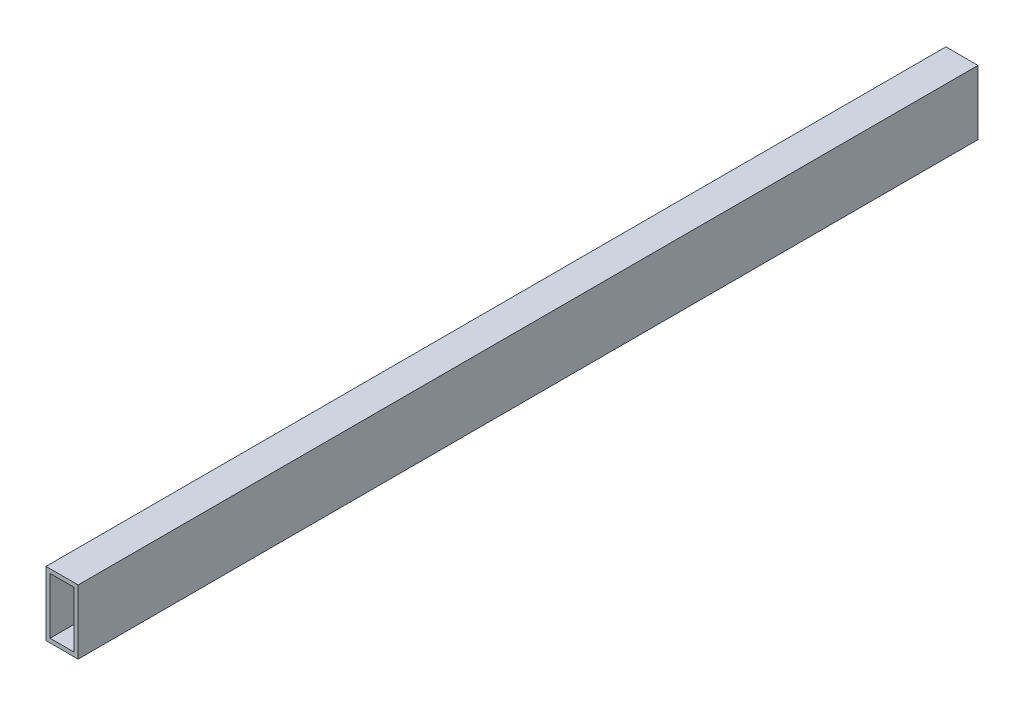
ISO-10303-21;
HEADER;
FILE_DESCRIPTION(('STEP AP214'),'2;1');
FILE_NAME('part.step','',(''),(''),'','','');
FILE_SCHEMA(('AUTOMOTIVE_DESIGN { 1 0 10303 214 1 1 1 1 }'));
ENDSEC;
DATA;
#1=APPLICATION_CONTEXT('core data for automotive mechanical design processes');
#2=APPLICATION_PROTOCOL_DEFINITION('international standard','automotive_design',2000,#1);
#3=PRODUCT_CONTEXT('',#1,'mechanical');
#4=PRODUCT('Part','Part','',(#3));
#5=PRODUCT_RELATED_PRODUCT_CATEGORY('part','',(#4));
#6=PRODUCT_DEFINITION_FORMATION('','',#4);
#7=PRODUCT_DEFINITION_CONTEXT('part definition',#1,'design');
#8=PRODUCT_DEFINITION('design','',#6,#7);
#9=PRODUCT_DEFINITION_SHAPE('','',#8);
#10=(LENGTH_UNIT() NAMED_UNIT(*) SI_UNIT(.MILLI.,.METRE.));
#11=(NAMED_UNIT(*) PLANE_ANGLE_UNIT() SI_UNIT($,.RADIAN.));
#12=(NAMED_UNIT(*) SI_UNIT($,.STERADIAN.) SOLID_ANGLE_UNIT());
#13=UNCERTAINTY_MEASURE_WITH_UNIT(LENGTH_MEASURE(1.E-05),#10,'distance_accuracy_value','');
#14=(GEOMETRIC_REPRESENTATION_CONTEXT(3) GLOBAL_UNCERTAINTY_ASSIGNED_CONTEXT((#13)) GLOBAL_UNIT_ASSIGNED_CONTEXT((#10,
#11,#12)) REPRESENTATION_CONTEXT('',''));
#15=CARTESIAN_POINT('',(0.,0.,0.));
#16=DIRECTION('',(0.,0.,1.));
#17=DIRECTION('',(1.,0.,0.));
#18=AXIS2_PLACEMENT_3D('',#15,#16,#17);
#19=CARTESIAN_POINT('',(12.7,25.4,749.3));
#20=DIRECTION('',(-1.,0.,0.));
#21=DIRECTION('',(0.,0.,1.));
#22=AXIS2_PLACEMENT_3D('',#19,#20,#21);
#23=PLANE('',#22);
#24=DIRECTION('',(0.,-1.,0.));
#25=VECTOR('',#24,1.);
#26=CARTESIAN_POINT('',(12.7,25.4,-355.6));
#27=LINE('',#26,#25);
#28=CARTESIAN_POINT('',(12.7,25.4,-355.6));
#29=VERTEX_POINT('',#28);
#30=CARTESIAN_POINT('',(12.7,-25.4,-355.6));
#31=VERTEX_POINT('',#30);
#32=EDGE_CURVE('E49',#29,#31,#27,.T.);
#33=ORIENTED_EDGE('',*,*,#32,.F.);
#34=DIRECTION('',(0.,0.,-1.));
#35=VECTOR('',#34,1.);
#36=CARTESIAN_POINT('',(12.7,25.4,749.3));
#37=LINE('',#36,#35);
#38=CARTESIAN_POINT('',(12.7,25.4,355.6));
#39=VERTEX_POINT('',#38);
#40=EDGE_CURVE('E120',#39,#29,#37,.T.);
#41=ORIENTED_EDGE('',*,*,#40,.F.);
#42=DIRECTION('',(0.,1.,0.));
#43=VECTOR('',#42,1.);
#44=CARTESIAN_POINT('',(12.7,25.4,355.6));
#45=LINE('',#44,#43);
#46=CARTESIAN_POINT('',(12.7,-25.4,355.6));
#47=VERTEX_POINT('',#46);
#48=EDGE_CURVE('E168',#47,#39,#45,.T.);
#49=ORIENTED_EDGE('',*,*,#48,.F.);
#50=DIRECTION('',(0.,0.,-1.));
#51=VECTOR('',#50,1.);
#52=CARTESIAN_POINT('',(12.7,-25.4,749.3));
#53=LINE('',#52,#51);
#54=EDGE_CURVE('E118',#47,#31,#53,.T.);
#55=ORIENTED_EDGE('',*,*,#54,.T.);
#56=EDGE_LOOP('',(#33,#41,#49,#55));
#57=FACE_BOUND('',#56,.T.);
#58=ADVANCED_FACE('F35',(#57),#23,.F.);
#59=CARTESIAN_POINT('',(-12.7,25.4,749.3));
#60=DIRECTION('',(0.,-1.,0.));
#61=DIRECTION('',(0.,0.,-1.));
#62=AXIS2_PLACEMENT_3D('',#59,#60,#61);
#63=PLANE('',#62);
#64=DIRECTION('',(1.,0.,0.));
#65=VECTOR('',#64,1.);
#66=CARTESIAN_POINT('',(12.7,25.4,-355.6));
#67=LINE('',#66,#65);
#68=CARTESIAN_POINT('',(-12.7,25.4,-355.6));
#69=VERTEX_POINT('',#68);
#70=EDGE_CURVE('E113',#69,#29,#67,.T.);
#71=ORIENTED_EDGE('',*,*,#70,.F.);
#72=DIRECTION('',(0.,0.,-1.));
#73=VECTOR('',#72,1.);
#74=CARTESIAN_POINT('',(-12.7,25.4,749.3));
#75=LINE('',#74,#73);
#76=CARTESIAN_POINT('',(-12.7,25.4,355.6));
#77=VERTEX_POINT('',#76);
#78=EDGE_CURVE('E112',#77,#69,#75,.T.);
#79=ORIENTED_EDGE('',*,*,#78,.F.);
#80=DIRECTION('',(-1.,0.,0.));
#81=VECTOR('',#80,1.);
#82=CARTESIAN_POINT('',(-12.7,25.4,355.6));
#83=LINE('',#82,#81);
#84=EDGE_CURVE('E170',#39,#77,#83,.T.);
#85=ORIENTED_EDGE('',*,*,#84,.F.);
#86=ORIENTED_EDGE('',*,*,#40,.T.);
#87=EDGE_LOOP('',(#71,#79,#85,#86));
#88=FACE_BOUND('',#87,.T.);
#89=ADVANCED_FACE('F182',(#88),#63,.F.);
#90=CARTESIAN_POINT('',(-12.7,25.4,749.3));
#91=DIRECTION('',(1.,0.,0.));
#92=DIRECTION('',(0.,0.,-1.));
#93=AXIS2_PLACEMENT_3D('',#90,#91,#92);
#94=PLANE('',#93);
#95=DIRECTION('',(0.,1.,0.));
#96=VECTOR('',#95,1.);
#97=CARTESIAN_POINT('',(-12.7,25.4,-355.6));
#98=LINE('',#97,#96);
#99=CARTESIAN_POINT('',(-12.7,-25.4,-355.6));
#100=VERTEX_POINT('',#99);
#101=EDGE_CURVE('E98',#100,#69,#98,.T.);
#102=ORIENTED_EDGE('',*,*,#101,.F.);
#103=DIRECTION('',(0.,0.,-1.));
#104=VECTOR('',#103,1.);
#105=CARTESIAN_POINT('',(-12.7,-25.4,749.3));
#106=LINE('',#105,#104);
#107=CARTESIAN_POINT('',(-12.7,-25.4,355.6));
#108=VERTEX_POINT('',#107);
#109=EDGE_CURVE('E110',#108,#100,#106,.T.);
#110=ORIENTED_EDGE('',*,*,#109,.F.);
#111=DIRECTION('',(0.,-1.,0.));
#112=VECTOR('',#111,1.);
#113=CARTESIAN_POINT('',(-12.7,25.4,355.6));
#114=LINE('',#113,#112);
#115=EDGE_CURVE('E161',#77,#108,#114,.T.);
#116=ORIENTED_EDGE('',*,*,#115,.F.);
#117=ORIENTED_EDGE('',*,*,#78,.T.);
#118=EDGE_LOOP('',(#102,#110,#116,#117));
#119=FACE_BOUND('',#118,.T.);
#120=ADVANCED_FACE('F108',(#119),#94,.F.);
#121=CARTESIAN_POINT('',(-12.7,-25.4,749.3));
#122=DIRECTION('',(0.,1.,0.));
#123=DIRECTION('',(0.,0.,1.));
#124=AXIS2_PLACEMENT_3D('',#121,#122,#123);
#125=PLANE('',#124);
#126=DIRECTION('',(-1.,0.,0.));
#127=VECTOR('',#126,1.);
#128=CARTESIAN_POINT('',(12.7,-25.4,-355.6));
#129=LINE('',#128,#127);
#130=EDGE_CURVE('E95',#31,#100,#129,.T.);
#131=ORIENTED_EDGE('',*,*,#130,.F.);
#132=ORIENTED_EDGE('',*,*,#54,.F.);
#133=DIRECTION('',(1.,0.,0.));
#134=VECTOR('',#133,1.);
#135=CARTESIAN_POINT('',(-12.7,-25.4,355.6));
#136=LINE('',#135,#134);
#137=EDGE_CURVE('E117',#108,#47,#136,.T.);
#138=ORIENTED_EDGE('',*,*,#137,.F.);
#139=ORIENTED_EDGE('',*,*,#109,.T.);
#140=EDGE_LOOP('',(#131,#132,#138,#139));
#141=FACE_BOUND('',#140,.T.);
#142=ADVANCED_FACE('F116',(#141),#125,.F.);
#143=CARTESIAN_POINT('',(9.49960000000001,22.1996,749.3));
#144=DIRECTION('',(-1.,0.,0.));
#145=DIRECTION('',(0.,0.,1.));
#146=AXIS2_PLACEMENT_3D('',#143,#144,#145);
#147=PLANE('',#146);
#148=DIRECTION('',(0.,0.,-1.));
#149=VECTOR('',#148,1.);
#150=CARTESIAN_POINT('',(9.49960000000001,22.1996,749.3));
#151=LINE('',#150,#149);
#152=CARTESIAN_POINT('',(9.49960000000001,22.1996,355.6));
#153=VERTEX_POINT('',#152);
#154=CARTESIAN_POINT('',(9.49960000000001,22.1996,-355.6));
#155=VERTEX_POINT('',#154);
#156=EDGE_CURVE('E122',#153,#155,#151,.T.);
#157=ORIENTED_EDGE('',*,*,#156,.T.);
#158=DIRECTION('',(0.,-1.,0.));
#159=VECTOR('',#158,1.);
#160=CARTESIAN_POINT('',(9.49960000000001,22.1996,-355.6));
#161=LINE('',#160,#159);
#162=CARTESIAN_POINT('',(9.49960000000001,-22.1996,-355.6));
#163=VERTEX_POINT('',#162);
#164=EDGE_CURVE('E145',#155,#163,#161,.T.);
#165=ORIENTED_EDGE('',*,*,#164,.T.);
#166=DIRECTION('',(0.,0.,-1.));
#167=VECTOR('',#166,1.);
#168=CARTESIAN_POINT('',(9.49960000000001,-22.1996,749.3));
#169=LINE('',#168,#167);
#170=CARTESIAN_POINT('',(9.49960000000001,-22.1996,355.6));
#171=VERTEX_POINT('',#170);
#172=EDGE_CURVE('E133',#171,#163,#169,.T.);
#173=ORIENTED_EDGE('',*,*,#172,.F.);
#174=DIRECTION('',(0.,1.,0.));
#175=VECTOR('',#174,1.);
#176=CARTESIAN_POINT('',(9.49960000000001,22.1996,355.6));
#177=LINE('',#176,#175);
#178=EDGE_CURVE('E143',#171,#153,#177,.T.);
#179=ORIENTED_EDGE('',*,*,#178,.T.);
#180=EDGE_LOOP('',(#157,#165,#173,#179));
#181=FACE_BOUND('',#180,.T.);
#182=ADVANCED_FACE('F142',(#181),#147,.T.);
#183=CARTESIAN_POINT('',(-9.4996,22.1996,749.3));
#184=DIRECTION('',(0.,-1.,0.));
#185=DIRECTION('',(0.,0.,-1.));
#186=AXIS2_PLACEMENT_3D('',#183,#184,#185);
#187=PLANE('',#186);
#188=DIRECTION('',(0.,0.,-1.));
#189=VECTOR('',#188,1.);
#190=CARTESIAN_POINT('',(-9.4996,22.1996,749.3));
#191=LINE('',#190,#189);
#192=CARTESIAN_POINT('',(-9.4996,22.1996,355.6));
#193=VERTEX_POINT('',#192);
#194=CARTESIAN_POINT('',(-9.4996,22.1996,-355.6));
#195=VERTEX_POINT('',#194);
#196=EDGE_CURVE('E147',#193,#195,#191,.T.);
#197=ORIENTED_EDGE('',*,*,#196,.T.);
#198=DIRECTION('',(1.,0.,0.));
#199=VECTOR('',#198,1.);
#200=CARTESIAN_POINT('',(-9.4996,22.1996,-355.6));
#201=LINE('',#200,#199);
#202=EDGE_CURVE('E159',#195,#155,#201,.T.);
#203=ORIENTED_EDGE('',*,*,#202,.T.);
#204=ORIENTED_EDGE('',*,*,#156,.F.);
#205=DIRECTION('',(-1.,0.,0.));
#206=VECTOR('',#205,1.);
#207=CARTESIAN_POINT('',(-9.4996,22.1996,355.6));
#208=LINE('',#207,#206);
#209=EDGE_CURVE('E149',#153,#193,#208,.T.);
#210=ORIENTED_EDGE('',*,*,#209,.T.);
#211=EDGE_LOOP('',(#197,#203,#204,#210));
#212=FACE_BOUND('',#211,.T.);
#213=ADVANCED_FACE('F157',(#212),#187,.T.);
#214=CARTESIAN_POINT('',(-9.4996,22.1996,749.3));
#215=DIRECTION('',(1.,0.,0.));
#216=DIRECTION('',(0.,0.,-1.));
#217=AXIS2_PLACEMENT_3D('',#214,#215,#216);
#218=PLANE('',#217);
#219=DIRECTION('',(0.,0.,-1.));
#220=VECTOR('',#219,1.);
#221=CARTESIAN_POINT('',(-9.4996,-22.1996,749.3));
#222=LINE('',#221,#220);
#223=CARTESIAN_POINT('',(-9.4996,-22.1996,355.6));
#224=VERTEX_POINT('',#223);
#225=CARTESIAN_POINT('',(-9.4996,-22.1996,-355.6));
#226=VERTEX_POINT('',#225);
#227=EDGE_CURVE('E135',#224,#226,#222,.T.);
#228=ORIENTED_EDGE('',*,*,#227,.T.);
#229=DIRECTION('',(0.,1.,0.));
#230=VECTOR('',#229,1.);
#231=CARTESIAN_POINT('',(-9.4996,22.1996,-355.6));
#232=LINE('',#231,#230);
#233=EDGE_CURVE('E57',#226,#195,#232,.T.);
#234=ORIENTED_EDGE('',*,*,#233,.T.);
#235=ORIENTED_EDGE('',*,*,#196,.F.);
#236=DIRECTION('',(0.,-1.,0.));
#237=VECTOR('',#236,1.);
#238=CARTESIAN_POINT('',(-9.4996,22.1996,355.6));
#239=LINE('',#238,#237);
#240=EDGE_CURVE('E172',#193,#224,#239,.T.);
#241=ORIENTED_EDGE('',*,*,#240,.T.);
#242=EDGE_LOOP('',(#228,#234,#235,#241));
#243=FACE_BOUND('',#242,.T.);
#244=ADVANCED_FACE('F174',(#243),#218,.T.);
#245=CARTESIAN_POINT('',(-9.4996,-22.1996,749.3));
#246=DIRECTION('',(0.,1.,0.));
#247=DIRECTION('',(0.,0.,1.));
#248=AXIS2_PLACEMENT_3D('',#245,#246,#247);
#249=PLANE('',#248);
#250=ORIENTED_EDGE('',*,*,#172,.T.);
#251=DIRECTION('',(-1.,0.,0.));
#252=VECTOR('',#251,1.);
#253=CARTESIAN_POINT('',(-9.4996,-22.1996,-355.6));
#254=LINE('',#253,#252);
#255=EDGE_CURVE('E11',#163,#226,#254,.T.);
#256=ORIENTED_EDGE('',*,*,#255,.T.);
#257=ORIENTED_EDGE('',*,*,#227,.F.);
#258=DIRECTION('',(1.,0.,0.));
#259=VECTOR('',#258,1.);
#260=CARTESIAN_POINT('',(-9.4996,-22.1996,355.6));
#261=LINE('',#260,#259);
#262=EDGE_CURVE('E42',#224,#171,#261,.T.);
#263=ORIENTED_EDGE('',*,*,#262,.T.);
#264=EDGE_LOOP('',(#250,#256,#257,#263));
#265=FACE_BOUND('',#264,.T.);
#266=ADVANCED_FACE('F132',(#265),#249,.T.);
#267=CARTESIAN_POINT('',(0.,0.,355.6));
#268=DIRECTION('',(0.,0.,1.));
#269=DIRECTION('',(1.,0.,0.));
#270=AXIS2_PLACEMENT_3D('',#267,#268,#269);
#271=PLANE('',#270);
#272=ORIENTED_EDGE('',*,*,#262,.F.);
#273=ORIENTED_EDGE('',*,*,#240,.F.);
#274=ORIENTED_EDGE('',*,*,#209,.F.);
#275=ORIENTED_EDGE('',*,*,#178,.F.);
#276=EDGE_LOOP('',(#272,#273,#274,#275));
#277=FACE_BOUND('',#276,.T.);
#278=ORIENTED_EDGE('',*,*,#115,.T.);
#279=ORIENTED_EDGE('',*,*,#137,.T.);
#280=ORIENTED_EDGE('',*,*,#48,.T.);
#281=ORIENTED_EDGE('',*,*,#84,.T.);
#282=EDGE_LOOP('',(#278,#279,#280,#281));
#283=FACE_BOUND('',#282,.T.);
#284=ADVANCED_FACE('F175',(#277,#283),#271,.T.);
#285=CARTESIAN_POINT('',(0.,0.,-355.6));
#286=DIRECTION('',(0.,0.,-1.));
#287=DIRECTION('',(-1.,0.,0.));
#288=AXIS2_PLACEMENT_3D('',#285,#286,#287);
#289=PLANE('',#288);
#290=ORIENTED_EDGE('',*,*,#202,.F.);
#291=ORIENTED_EDGE('',*,*,#233,.F.);
#292=ORIENTED_EDGE('',*,*,#255,.F.);
#293=ORIENTED_EDGE('',*,*,#164,.F.);
#294=EDGE_LOOP('',(#290,#291,#292,#293));
#295=FACE_BOUND('',#294,.T.);
#296=ORIENTED_EDGE('',*,*,#32,.T.);
#297=ORIENTED_EDGE('',*,*,#130,.T.);
#298=ORIENTED_EDGE('',*,*,#101,.T.);
#299=ORIENTED_EDGE('',*,*,#70,.T.);
#300=EDGE_LOOP('',(#296,#297,#298,#299));
#301=FACE_BOUND('',#300,.T.);
#302=ADVANCED_FACE('F97',(#295,#301),#289,.T.);
#303=CLOSED_SHELL('',(#58,#89,#120,#142,#182,#213,#244,#266,#284,#302));
#304=MANIFOLD_SOLID_BREP('B2',#303);
#305=ADVANCED_BREP_SHAPE_REPRESENTATION('',(#18,#304),#14);
#306=SHAPE_DEFINITION_REPRESENTATION(#9,#305);
ENDSEC;
END-ISO-10303-21;
